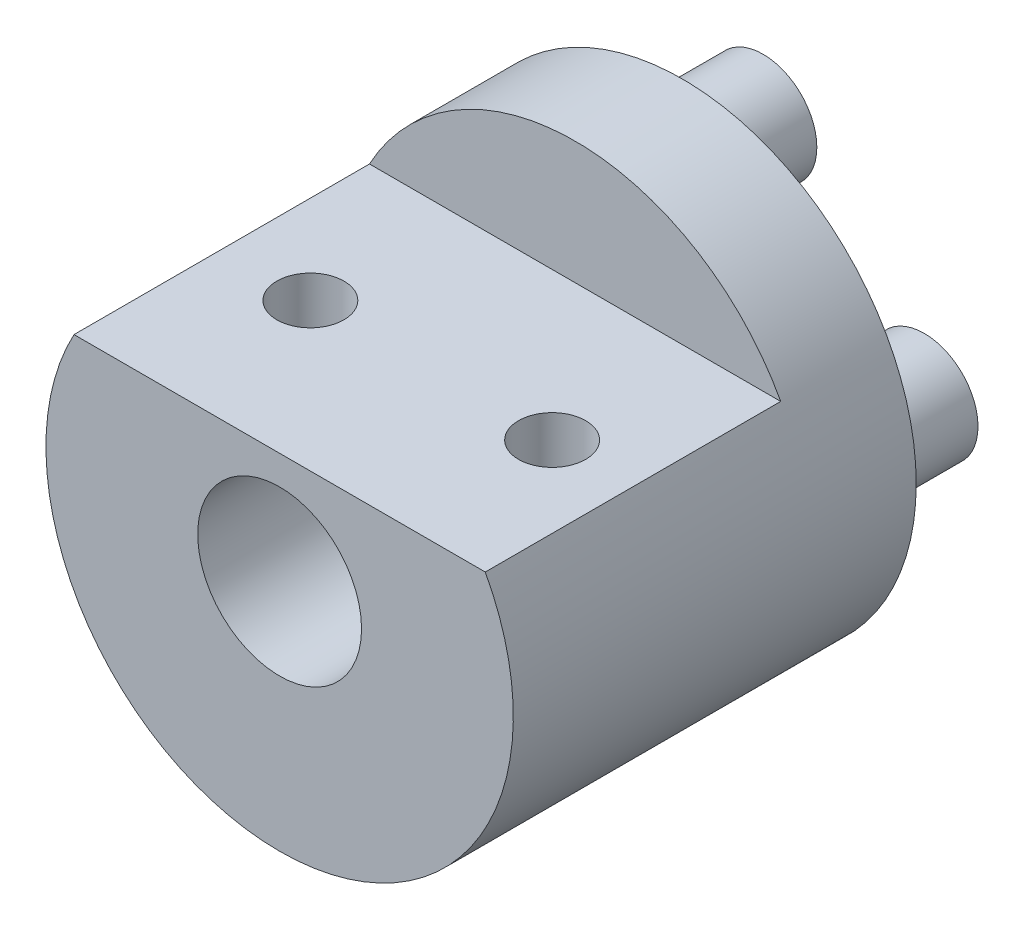
ISO-10303-21;
HEADER;
FILE_DESCRIPTION(('STEP AP214'),'2;1');
FILE_NAME('part.step','',(''),(''),'','','');
FILE_SCHEMA(('AUTOMOTIVE_DESIGN { 1 0 10303 214 1 1 1 1 }'));
ENDSEC;
DATA;
#1=APPLICATION_CONTEXT('core data for automotive mechanical design processes');
#2=APPLICATION_PROTOCOL_DEFINITION('international standard','automotive_design',2000,#1);
#3=PRODUCT_CONTEXT('',#1,'mechanical');
#4=PRODUCT('Part','Part','',(#3));
#5=PRODUCT_RELATED_PRODUCT_CATEGORY('part','',(#4));
#6=PRODUCT_DEFINITION_FORMATION('','',#4);
#7=PRODUCT_DEFINITION_CONTEXT('part definition',#1,'design');
#8=PRODUCT_DEFINITION('design','',#6,#7);
#9=PRODUCT_DEFINITION_SHAPE('','',#8);
#10=(LENGTH_UNIT() NAMED_UNIT(*) SI_UNIT(.MILLI.,.METRE.));
#11=(NAMED_UNIT(*) PLANE_ANGLE_UNIT() SI_UNIT($,.RADIAN.));
#12=(NAMED_UNIT(*) SI_UNIT($,.STERADIAN.) SOLID_ANGLE_UNIT());
#13=UNCERTAINTY_MEASURE_WITH_UNIT(LENGTH_MEASURE(1.E-05),#10,'distance_accuracy_value','');
#14=(GEOMETRIC_REPRESENTATION_CONTEXT(3) GLOBAL_UNCERTAINTY_ASSIGNED_CONTEXT((#13)) GLOBAL_UNIT_ASSIGNED_CONTEXT((#10,
#11,#12)) REPRESENTATION_CONTEXT('',''));
#15=CARTESIAN_POINT('',(0.,0.,0.));
#16=DIRECTION('',(0.,0.,1.));
#17=DIRECTION('',(1.,0.,0.));
#18=AXIS2_PLACEMENT_3D('',#15,#16,#17);
#19=CARTESIAN_POINT('',(0.,0.,15.));
#20=DIRECTION('',(0.,0.,-1.));
#21=DIRECTION('',(-1.,0.,0.));
#22=AXIS2_PLACEMENT_3D('',#19,#20,#21);
#23=CYLINDRICAL_SURFACE('',#22,1.75);
#24=CARTESIAN_POINT('',(0.,0.,2.7));
#25=DIRECTION('',(0.,0.,1.));
#26=DIRECTION('',(1.,0.,0.));
#27=AXIS2_PLACEMENT_3D('',#24,#25,#26);
#28=CIRCLE('',#27,1.75);
#29=CARTESIAN_POINT('',(1.75,0.,2.7));
#30=VERTEX_POINT('',#29);
#31=EDGE_CURVE('E96',#30,#30,#28,.T.);
#32=ORIENTED_EDGE('',*,*,#31,.T.);
#33=EDGE_LOOP('',(#32));
#34=FACE_BOUND('',#33,.T.);
#35=CARTESIAN_POINT('',(0.,0.,0.));
#36=DIRECTION('',(0.,0.,-1.));
#37=DIRECTION('',(-1.,0.,0.));
#38=AXIS2_PLACEMENT_3D('',#35,#36,#37);
#39=CIRCLE('',#38,1.75);
#40=CARTESIAN_POINT('',(-1.75,0.,0.));
#41=VERTEX_POINT('',#40);
#42=EDGE_CURVE('E87',#41,#41,#39,.T.);
#43=ORIENTED_EDGE('',*,*,#42,.T.);
#44=EDGE_LOOP('',(#43));
#45=FACE_BOUND('',#44,.T.);
#46=ADVANCED_FACE('F35',(#34,#45),#23,.F.);
#47=CARTESIAN_POINT('',(0.,0.,15.));
#48=DIRECTION('',(0.,0.,-1.));
#49=DIRECTION('',(-1.,0.,0.));
#50=AXIS2_PLACEMENT_3D('',#47,#48,#49);
#51=CYLINDRICAL_SURFACE('',#50,8.7);
#52=CARTESIAN_POINT('',(-4.35554645653572,-7.53121604158048,10.75));
#53=CARTESIAN_POINT('',(-4.28149878792105,-7.57403985078422,10.7499988824261));
#54=CARTESIAN_POINT('',(-4.20679899775351,-7.6157720088627,10.7434172999534));
#55=CARTESIAN_POINT('',(-4.058121338259,-7.69602383094756,10.7164465241141));
#56=CARTESIAN_POINT('',(-3.98414341685853,-7.73454372821252,10.6960583342979));
#57=CARTESIAN_POINT('',(-3.83901906859396,-7.8075966939334,10.6409439535076));
#58=CARTESIAN_POINT('',(-3.76788983037047,-7.84210742418347,10.6061419391379));
#59=CARTESIAN_POINT('',(-3.63192021432966,-7.90599758290411,10.5223639350081));
#60=CARTESIAN_POINT('',(-3.56707611267814,-7.93538005814271,10.4733964074525));
#61=CARTESIAN_POINT('',(-3.45309068809177,-7.98559036582203,10.3680263907658));
#62=CARTESIAN_POINT('',(-3.403021384501,-8.00698604983009,10.3128983850275));
#63=CARTESIAN_POINT('',(-3.31287797876676,-8.04470220268777,10.1934889195014));
#64=CARTESIAN_POINT('',(-3.27279774697054,-8.06102578548573,10.1292131113693));
#65=CARTESIAN_POINT('',(-3.20777259685441,-8.08710779781152,9.99986490603887));
#66=CARTESIAN_POINT('',(-3.18177054031545,-8.09733386209012,9.93541624887368));
#67=CARTESIAN_POINT('',(-3.14073715017222,-8.1133384408927,9.80259502329288));
#68=CARTESIAN_POINT('',(-3.12570217766223,-8.11911843066997,9.73422376453554));
#69=CARTESIAN_POINT('',(-3.10770192323431,-8.1260246466137,9.59904656186811));
#70=CARTESIAN_POINT('',(-3.10419120597139,-8.12736121821751,9.53232335431742));
#71=CARTESIAN_POINT('',(-3.10783924048391,-8.12596698689866,9.39921652288701));
#72=CARTESIAN_POINT('',(-3.11499661459986,-8.12323670916216,9.33283285627035));
#73=CARTESIAN_POINT('',(-3.13952852029316,-8.11378627715154,9.20318925821245));
#74=CARTESIAN_POINT('',(-3.15676797607309,-8.10711885987948,9.1398997975745));
#75=CARTESIAN_POINT('',(-3.2006856292849,-8.08988035802882,9.01725857483689));
#76=CARTESIAN_POINT('',(-3.22736391032928,-8.0793092388698,8.95790684762463));
#77=CARTESIAN_POINT('',(-3.28961835843052,-8.05416348708958,8.84381129378489));
#78=CARTESIAN_POINT('',(-3.32532164067727,-8.03953133982351,8.78914966344295));
#79=CARTESIAN_POINT('',(-3.40409496677691,-8.00649471425805,8.68672467884416));
#80=CARTESIAN_POINT('',(-3.44716605566785,-7.98808970074772,8.63896230494194));
#81=CARTESIAN_POINT('',(-3.54127451350286,-7.94683116418959,8.54927692058152));
#82=CARTESIAN_POINT('',(-3.5925838775501,-7.9238142286656,8.50771521837535));
#83=CARTESIAN_POINT('',(-3.699888900641,-7.87428188390073,8.433761787893));
#84=CARTESIAN_POINT('',(-3.75588591487718,-7.84776546167739,8.40137272335644));
#85=CARTESIAN_POINT('',(-3.87550593292527,-7.78943004826004,8.34379435180282));
#86=CARTESIAN_POINT('',(-3.93938069184815,-7.75735660195546,8.31938778678246));
#87=CARTESIAN_POINT('',(-4.06878585960677,-7.69027326452496,8.28146767074153));
#88=CARTESIAN_POINT('',(-4.13431697913613,-7.65526209743806,8.26795888034951));
#89=CARTESIAN_POINT('',(-4.27265001751912,-7.57900754201518,8.25059802402398));
#90=CARTESIAN_POINT('',(-4.34546050863245,-7.53750189370464,8.2479686247479));
#91=CARTESIAN_POINT('',(-4.48938692212858,-7.45267725421673,8.25509628897069));
#92=CARTESIAN_POINT('',(-4.56050214329249,-7.40935753242356,8.26485839044058));
#93=CARTESIAN_POINT('',(-4.70721575394475,-7.31713164912699,8.29788296987201));
#94=CARTESIAN_POINT('',(-4.78245207249042,-7.26813328827647,8.32250698462216));
#95=CARTESIAN_POINT('',(-4.92738169490002,-7.17067304207176,8.38565603972446));
#96=CARTESIAN_POINT('',(-4.99706784244223,-7.1222119165343,8.42419868342731));
#97=CARTESIAN_POINT('',(-5.13174031437103,-7.02583586020076,8.51665224966802));
#98=CARTESIAN_POINT('',(-5.19641593592393,-6.97802516326073,8.57112949773591));
#99=CARTESIAN_POINT('',(-5.31512710158141,-6.88802918069736,8.69440242509238));
#100=CARTESIAN_POINT('',(-5.36918991769288,-6.84582956871627,8.76316044440218));
#101=CARTESIAN_POINT('',(-5.44687989098039,-6.78402925327167,8.88775355171929));
#102=CARTESIAN_POINT('',(-5.47454434347002,-6.76168133970736,8.93972469392046));
#103=CARTESIAN_POINT('',(-5.52277650634889,-6.72234380609106,9.04876067975398));
#104=CARTESIAN_POINT('',(-5.54335112681032,-6.70534897008306,9.10582049504727));
#105=CARTESIAN_POINT('',(-5.5763339735623,-6.67794671715438,9.22434082718149));
#106=CARTESIAN_POINT('',(-5.58867457277922,-6.66759387782214,9.28583329891102));
#107=CARTESIAN_POINT('',(-5.60394145601439,-6.6547687662612,9.41078074175519));
#108=CARTESIAN_POINT('',(-5.60687466462078,-6.65229069758694,9.47423423464942));
#109=CARTESIAN_POINT('',(-5.60333517184121,-6.6552709784949,9.59266322631293));
#110=CARTESIAN_POINT('',(-5.59799726629332,-6.65977187131449,9.64770282965563));
#111=CARTESIAN_POINT('',(-5.58031434568902,-6.67459536231319,9.75582150908871));
#112=CARTESIAN_POINT('',(-5.56796868521173,-6.68491849672572,9.80890040411633));
#113=CARTESIAN_POINT('',(-5.53687983276616,-6.71069046084524,9.91216425556949));
#114=CARTESIAN_POINT('',(-5.51809925111089,-6.72616923203743,9.96233024840284));
#115=CARTESIAN_POINT('',(-5.47500815035938,-6.76129122797592,10.0586545118619));
#116=CARTESIAN_POINT('',(-5.45069410735352,-6.78093710594314,10.1048102025867));
#117=CARTESIAN_POINT('',(-5.38585488482925,-6.83263747879325,10.2115957394805));
#118=CARTESIAN_POINT('',(-5.34285612284773,-6.86639368630915,10.2699070306361));
#119=CARTESIAN_POINT('',(-5.24919553901838,-6.93825921107654,10.376906325849));
#120=CARTESIAN_POINT('',(-5.19852154155506,-6.97637542087524,10.4255787510451));
#121=CARTESIAN_POINT('',(-5.09035826441648,-7.05569331739473,10.5136451353217));
#122=CARTESIAN_POINT('',(-5.03278745787572,-7.09692924072274,10.5529073762566));
#123=CARTESIAN_POINT('',(-4.91268326175512,-7.18059197855183,10.6211007726175));
#124=CARTESIAN_POINT('',(-4.85015155631513,-7.22301838576966,10.650035415897));
#125=CARTESIAN_POINT('',(-4.71738413097553,-7.31046988360632,10.6986923816817));
#126=CARTESIAN_POINT('',(-4.64691138202164,-7.35549922429417,10.7177632502662));
#127=CARTESIAN_POINT('',(-4.50302567704536,-7.44445522884208,10.7434185422925));
#128=CARTESIAN_POINT('',(-4.42961228753875,-7.48838172856658,10.750001117848));
#129=CARTESIAN_POINT('',(-4.35554645653572,-7.53121604158048,10.75));
#130=B_SPLINE_CURVE_WITH_KNOTS('',3,(#52,#53,#54,#55,#56,#57,#58,#59,#60,#61,#62,#63,#64,#65,
#66,#67,#68,#69,#70,#71,#72,#73,#74,#75,#76,#77,#78,#79,#80,#81,#82,#83,#84,#85,#86,#87,#88,#89,
#90,#91,#92,#93,#94,#95,#96,#97,#98,#99,#100,#101,#102,#103,#104,#105,#106,#107,#108,#109,#110,
#111,#112,#113,#114,#115,#116,#117,#118,#119,#120,#121,#122,#123,#124,#125,#126,#127,#128,#129),
.UNSPECIFIED.,.T.,.F.,(4,2,2,2,2,2,2,2,2,2,2,2,2,2,2,2,2,2,2,2,2,2,2,2,2,2,2,2,2,2,2,2,2,2,2,2,
2,2,4),(0.,0.256354012468137,0.512689393529676,0.770390698269476,1.02793837400122,
1.25911786387568,1.49015514249363,1.69981973094638,1.90941472048425,2.1089347352682,
2.30842898660295,2.50530981037037,2.7021923782227,2.90201966410702,3.10187531671454,
3.31076028448924,3.51970585053031,3.74535814046613,3.97110895197533,4.22163818513199,
4.47226930775334,4.75035105872889,5.02878574774849,5.31865944443633,5.60777820314424,
5.79600067095043,5.98403916625163,6.17360363552678,6.36302853820438,6.52866853488511,
6.69432378964269,6.86095837132265,7.02769937040053,7.26619354220559,7.50507009054242,
7.74711702856552,7.98908214457701,8.24546110217311,8.50187799307103),.UNSPECIFIED.);
#131=CARTESIAN_POINT('',(-4.35554645653572,-7.53121604158048,10.75));
#132=VERTEX_POINT('',#131);
#133=EDGE_CURVE('E107',#132,#132,#130,.T.);
#134=ORIENTED_EDGE('',*,*,#133,.T.);
#135=EDGE_LOOP('',(#134));
#136=FACE_BOUND('',#135,.T.);
#137=CARTESIAN_POINT('',(4.64445354346428,-7.35656518237976,10.75));
#138=CARTESIAN_POINT('',(4.73428230230111,-7.29984922243143,10.7499983136137));
#139=CARTESIAN_POINT('',(4.82314577905018,-7.2414214920152,10.7403108379036));
#140=CARTESIAN_POINT('',(4.99618931123596,-7.12314110640561,10.7027704708671));
#141=CARTESIAN_POINT('',(5.08035622320646,-7.06328506205961,10.6748691285672));
#142=CARTESIAN_POINT('',(5.23709976608238,-6.94778668937354,10.6037511868211));
#143=CARTESIAN_POINT('',(5.31005914949701,-6.8920935616727,10.5614604777866));
#144=CARTESIAN_POINT('',(5.44746861487665,-6.78400224565856,10.4616938314708));
#145=CARTESIAN_POINT('',(5.51193557488742,-6.73159763369121,10.4042487165379));
#146=CARTESIAN_POINT('',(5.61247164751777,-6.6477912175443,10.2932781396885));
#147=CARTESIAN_POINT('',(5.65133098499533,-6.61473024986206,10.2435228607141));
#148=CARTESIAN_POINT('',(5.72212601356684,-6.55358307905767,10.1365683333737));
#149=CARTESIAN_POINT('',(5.75407214642718,-6.52548938523095,10.0793805232828));
#150=CARTESIAN_POINT('',(5.80407862243176,-6.48101655237665,9.96975939795487));
#151=CARTESIAN_POINT('',(5.82362544498334,-6.46342498298962,9.91850141315648));
#152=CARTESIAN_POINT('',(5.85607411170827,-6.43404059214989,9.81232782637395));
#153=CARTESIAN_POINT('',(5.86898090000497,-6.42224345649926,9.75741498028328));
#154=CARTESIAN_POINT('',(5.88733274949459,-6.40542544533612,9.64495913743597));
#155=CARTESIAN_POINT('',(5.8927319531199,-6.40044621752587,9.5874021759067));
#156=CARTESIAN_POINT('',(5.89547077483609,-6.39792385227537,9.47193836952545));
#157=CARTESIAN_POINT('',(5.89281267574331,-6.40037860861885,9.41403162841342));
#158=CARTESIAN_POINT('',(5.8803145370671,-6.41186077166845,9.30546860491093));
#159=CARTESIAN_POINT('',(5.8711968165059,-6.42022692943234,9.25465421489561));
#160=CARTESIAN_POINT('',(5.84715372230549,-6.44213135546349,9.15559624757732));
#161=CARTESIAN_POINT('',(5.83222594517264,-6.45567176416327,9.10735374361014));
#162=CARTESIAN_POINT('',(5.79178353899904,-6.49200967224084,8.99959500985601));
#163=CARTESIAN_POINT('',(5.76441582800212,-6.51637925823997,8.94130530481673));
#164=CARTESIAN_POINT('',(5.70253292637202,-6.57060229886083,8.83144795773739));
#165=CARTESIAN_POINT('',(5.66800402887094,-6.60046625742358,8.77989352038598));
#166=CARTESIAN_POINT('',(5.58212637813298,-6.67337141569234,8.66964683231964));
#167=CARTESIAN_POINT('',(5.5288205973738,-6.7177010498057,8.61333514100248));
#168=CARTESIAN_POINT('',(5.41473924025292,-6.80999269762562,8.51259861249486));
#169=CARTESIAN_POINT('',(5.35395811347324,-6.85795740009236,8.46818268657257));
#170=CARTESIAN_POINT('',(5.22551182965627,-6.95634016347321,8.39068473335128));
#171=CARTESIAN_POINT('',(5.15775364445237,-7.00678490611968,8.35779141943087));
#172=CARTESIAN_POINT('',(5.01757945724511,-7.10783858414739,8.30463528314732));
#173=CARTESIAN_POINT('',(4.94516309441601,-7.15844753195906,8.28437344052975));
#174=CARTESIAN_POINT('',(4.78784248337087,-7.26475325035045,8.25536979485192));
#175=CARTESIAN_POINT('',(4.70250509742067,-7.32030018077563,8.24837370267425));
#176=CARTESIAN_POINT('',(4.53013885869342,-7.42820094909709,8.25225948480602));
#177=CARTESIAN_POINT('',(4.44310987202303,-7.48055453286571,8.2631427800434));
#178=CARTESIAN_POINT('',(4.27551026178594,-7.57752283881265,8.30276638982953));
#179=CARTESIAN_POINT('',(4.19485300894459,-7.62240792215604,8.33046050509193));
#180=CARTESIAN_POINT('',(4.03852709516364,-7.70637063686511,8.40329527767624));
#181=CARTESIAN_POINT('',(3.96285241043469,-7.74545535520232,8.44841439784484));
#182=CARTESIAN_POINT('',(3.83070902315208,-7.81155318704061,8.54806493409714));
#183=CARTESIAN_POINT('',(3.77303552262498,-7.83949071523474,8.60038535582493));
#184=CARTESIAN_POINT('',(3.66739710700461,-7.88946227952929,8.71642059311788));
#185=CARTESIAN_POINT('',(3.61942318987217,-7.9115017956929,8.78012473919169));
#186=CARTESIAN_POINT('',(3.54120325208681,-7.94679127845431,8.90818850674592));
#187=CARTESIAN_POINT('',(3.50948066909118,-7.96080140401014,8.97144075970005));
#188=CARTESIAN_POINT('',(3.45699188303596,-7.98373559751052,9.10319561440127));
#189=CARTESIAN_POINT('',(3.43622011334944,-7.99266224972251,9.17169552828291));
#190=CARTESIAN_POINT('',(3.40773007893375,-8.00484840453101,9.30656479696421));
#191=CARTESIAN_POINT('',(3.399169479977,-8.00847409166782,9.37272455138988));
#192=CARTESIAN_POINT('',(3.39269787183453,-8.01121809913537,9.50565076932581));
#193=CARTESIAN_POINT('',(3.39478455158121,-8.01033739760974,9.57241709803437));
#194=CARTESIAN_POINT('',(3.4093205911866,-8.00416082818338,9.70283219411439));
#195=CARTESIAN_POINT('',(3.42149946050285,-7.9989802009672,9.76651689580116));
#196=CARTESIAN_POINT('',(3.45536613556075,-7.98440866320842,9.89079265559));
#197=CARTESIAN_POINT('',(3.47705379740851,-7.97501781637784,9.95138376049112));
#198=CARTESIAN_POINT('',(3.52934766517927,-7.95201387607259,10.0685027701869));
#199=CARTESIAN_POINT('',(3.56004550108902,-7.93835730536109,10.1249810937992));
#200=CARTESIAN_POINT('',(3.62907392856332,-7.90703829819907,10.2318135829642));
#201=CARTESIAN_POINT('',(3.66740533499118,-7.8893754340594,10.2821670937842));
#202=CARTESIAN_POINT('',(3.75222785187461,-7.84939984398766,10.3779001673907));
#203=CARTESIAN_POINT('',(3.79901299741493,-7.82691073092811,10.4229447992096));
#204=CARTESIAN_POINT('',(3.897769094742,-7.77820206669522,10.5045245274185));
#205=CARTESIAN_POINT('',(3.94974245108751,-7.75198078336838,10.5410556516885));
#206=CARTESIAN_POINT('',(4.06183113668099,-7.69388320320527,10.6080017173438));
#207=CARTESIAN_POINT('',(4.12226293250348,-7.66171551941534,10.6376311975813));
#208=CARTESIAN_POINT('',(4.24543121382603,-7.59415858454734,10.6864528626467));
#209=CARTESIAN_POINT('',(4.30816693121406,-7.55877040144969,10.7056484929251));
#210=CARTESIAN_POINT('',(4.41673000242855,-7.49568348641554,10.7299657532556));
#211=CARTESIAN_POINT('',(4.46238878582519,-7.46859577643745,10.7375203034684));
#212=CARTESIAN_POINT('',(4.55359807559967,-7.41333894036497,10.7475379555902));
#213=CARTESIAN_POINT('',(4.59914857750075,-7.38516977035714,10.7500008505257));
#214=CARTESIAN_POINT('',(4.64445354346428,-7.35656518237976,10.75));
#215=B_SPLINE_CURVE_WITH_KNOTS('',3,(#137,#138,#139,#140,#141,#142,#143,#144,#145,#146,#147,
#148,#149,#150,#151,#152,#153,#154,#155,#156,#157,#158,#159,#160,#161,#162,#163,#164,#165,#166,
#167,#168,#169,#170,#171,#172,#173,#174,#175,#176,#177,#178,#179,#180,#181,#182,#183,#184,#185,
#186,#187,#188,#189,#190,#191,#192,#193,#194,#195,#196,#197,#198,#199,#200,#201,#202,#203,#204,
#205,#206,#207,#208,#209,#210,#211,#212,#213,#214),.UNSPECIFIED.,.T.,.F.,(4,2,2,2,2,2,2,2,2,2,2,
2,2,2,2,2,2,2,2,2,2,2,2,2,2,2,2,2,2,2,2,2,2,2,2,2,2,2,4),(0.,0.318485737291531,
0.637822154582837,0.939609839498167,1.24078839233826,1.45385301696372,1.66659354527922,
1.83873587250943,2.01074983756833,2.18380994441863,2.35682102400452,2.51303517855028,
2.66931402428599,2.8747461182859,3.08057510973484,3.34712090760409,3.61386582332708,
3.8847949266197,4.15574504160377,4.46038594886418,4.76505106801209,5.05246213925765,
5.33951910400322,5.58627180592603,5.83279443836167,6.04805794681694,6.26321192460611,
6.46265706128622,6.66205890882225,6.85628296835601,7.05050408885306,7.24677316875707,
7.44306321110347,7.64837403869651,7.85378046658136,8.07667389580228,8.29949367670213,
8.46011483164745,8.62074251563972),.UNSPECIFIED.);
#216=CARTESIAN_POINT('',(4.64445354346428,-7.35656518237976,10.75));
#217=VERTEX_POINT('',#216);
#218=EDGE_CURVE('E100',#217,#217,#215,.T.);
#219=ORIENTED_EDGE('',*,*,#218,.T.);
#220=EDGE_LOOP('',(#219));
#221=FACE_BOUND('',#220,.T.);
#222=CARTESIAN_POINT('',(0.,0.,15.));
#223=DIRECTION('',(0.,0.,1.));
#224=DIRECTION('',(1.,0.,0.));
#225=AXIS2_PLACEMENT_3D('',#222,#223,#224);
#226=CIRCLE('',#225,8.7);
#227=CARTESIAN_POINT('',(-7.65554645653572,4.1331112314845,15.));
#228=VERTEX_POINT('',#227);
#229=CARTESIAN_POINT('',(7.65554645653572,4.1331112314845,15.));
#230=VERTEX_POINT('',#229);
#231=EDGE_CURVE('E67',#228,#230,#226,.T.);
#232=ORIENTED_EDGE('',*,*,#231,.F.);
#233=DIRECTION('',(0.,0.,1.));
#234=VECTOR('',#233,1.);
#235=CARTESIAN_POINT('',(-7.65554645653572,4.1331112314845,4.));
#236=LINE('',#235,#234);
#237=CARTESIAN_POINT('',(-7.65554645653572,4.1331112314845,4.));
#238=VERTEX_POINT('',#237);
#239=EDGE_CURVE('E50',#238,#228,#236,.T.);
#240=ORIENTED_EDGE('',*,*,#239,.F.);
#241=CARTESIAN_POINT('',(0.,0.,4.));
#242=DIRECTION('',(0.,0.,1.));
#243=DIRECTION('',(1.,0.,0.));
#244=AXIS2_PLACEMENT_3D('',#241,#242,#243);
#245=CIRCLE('',#244,8.7);
#246=CARTESIAN_POINT('',(7.65554645653572,4.1331112314845,4.));
#247=VERTEX_POINT('',#246);
#248=EDGE_CURVE('E57',#247,#238,#245,.T.);
#249=ORIENTED_EDGE('',*,*,#248,.F.);
#250=DIRECTION('',(0.,0.,-1.));
#251=VECTOR('',#250,1.);
#252=CARTESIAN_POINT('',(7.65554645653572,4.1331112314845,15.));
#253=LINE('',#252,#251);
#254=EDGE_CURVE('E70',#247,#230,#253,.F.);
#255=ORIENTED_EDGE('',*,*,#254,.T.);
#256=EDGE_LOOP('',(#232,#240,#249,#255));
#257=FACE_BOUND('',#256,.T.);
#258=CARTESIAN_POINT('',(0.,0.,0.));
#259=DIRECTION('',(0.,0.,1.));
#260=DIRECTION('',(1.,0.,0.));
#261=AXIS2_PLACEMENT_3D('',#258,#259,#260);
#262=CIRCLE('',#261,8.7);
#263=CARTESIAN_POINT('',(8.7,0.,0.));
#264=VERTEX_POINT('',#263);
#265=EDGE_CURVE('E90',#264,#264,#262,.T.);
#266=ORIENTED_EDGE('',*,*,#265,.T.);
#267=EDGE_LOOP('',(#266));
#268=FACE_BOUND('',#267,.T.);
#269=ADVANCED_FACE('F74',(#136,#221,#257,#268),#51,.T.);
#270=CARTESIAN_POINT('',(0.,0.,15.));
#271=DIRECTION('',(0.,0.,1.));
#272=DIRECTION('',(1.,0.,0.));
#273=AXIS2_PLACEMENT_3D('',#270,#271,#272);
#274=PLANE('',#273);
#275=DIRECTION('',(1.,0.,0.));
#276=VECTOR('',#275,1.);
#277=CARTESIAN_POINT('',(-7.65554645653572,4.1331112314845,15.));
#278=LINE('',#277,#276);
#279=EDGE_CURVE('E71',#228,#230,#278,.T.);
#280=ORIENTED_EDGE('',*,*,#279,.F.);
#281=ORIENTED_EDGE('',*,*,#231,.T.);
#282=EDGE_LOOP('',(#280,#281));
#283=FACE_BOUND('',#282,.T.);
#284=CARTESIAN_POINT('',(0.,0.,15.));
#285=DIRECTION('',(0.,0.,1.));
#286=DIRECTION('',(1.,0.,0.));
#287=AXIS2_PLACEMENT_3D('',#284,#285,#286);
#288=CIRCLE('',#287,3.05);
#289=CARTESIAN_POINT('',(3.05,0.,15.));
#290=VERTEX_POINT('',#289);
#291=EDGE_CURVE('E78',#290,#290,#288,.T.);
#292=ORIENTED_EDGE('',*,*,#291,.F.);
#293=EDGE_LOOP('',(#292));
#294=FACE_BOUND('',#293,.T.);
#295=ADVANCED_FACE('F139',(#283,#294),#274,.T.);
#296=CARTESIAN_POINT('',(0.,0.,0.));
#297=DIRECTION('',(0.,0.,1.));
#298=DIRECTION('',(1.,0.,0.));
#299=AXIS2_PLACEMENT_3D('',#296,#297,#298);
#300=PLANE('',#299);
#301=CARTESIAN_POINT('',(6.,0.,0.));
#302=DIRECTION('',(0.,0.,1.));
#303=DIRECTION('',(1.,0.,0.));
#304=AXIS2_PLACEMENT_3D('',#301,#302,#303);
#305=CIRCLE('',#304,2.);
#306=CARTESIAN_POINT('',(8.,0.,0.));
#307=VERTEX_POINT('',#306);
#308=EDGE_CURVE('E12',#307,#307,#305,.F.);
#309=ORIENTED_EDGE('',*,*,#308,.F.);
#310=EDGE_LOOP('',(#309));
#311=FACE_BOUND('',#310,.T.);
#312=CARTESIAN_POINT('',(0.,-6.,0.));
#313=DIRECTION('',(0.,0.,1.));
#314=DIRECTION('',(1.,0.,0.));
#315=AXIS2_PLACEMENT_3D('',#312,#313,#314);
#316=CIRCLE('',#315,2.);
#317=CARTESIAN_POINT('',(2.,-6.,0.));
#318=VERTEX_POINT('',#317);
#319=EDGE_CURVE('E43',#318,#318,#316,.F.);
#320=ORIENTED_EDGE('',*,*,#319,.F.);
#321=EDGE_LOOP('',(#320));
#322=FACE_BOUND('',#321,.T.);
#323=CARTESIAN_POINT('',(-6.,0.,0.));
#324=DIRECTION('',(0.,0.,1.));
#325=DIRECTION('',(1.,0.,0.));
#326=AXIS2_PLACEMENT_3D('',#323,#324,#325);
#327=CIRCLE('',#326,2.);
#328=CARTESIAN_POINT('',(-4.,0.,0.));
#329=VERTEX_POINT('',#328);
#330=EDGE_CURVE('E154',#329,#329,#327,.F.);
#331=ORIENTED_EDGE('',*,*,#330,.F.);
#332=EDGE_LOOP('',(#331));
#333=FACE_BOUND('',#332,.T.);
#334=CARTESIAN_POINT('',(0.,6.,0.));
#335=DIRECTION('',(0.,0.,1.));
#336=DIRECTION('',(1.,0.,0.));
#337=AXIS2_PLACEMENT_3D('',#334,#335,#336);
#338=CIRCLE('',#337,2.);
#339=CARTESIAN_POINT('',(2.,6.,0.));
#340=VERTEX_POINT('',#339);
#341=EDGE_CURVE('E99',#340,#340,#338,.F.);
#342=ORIENTED_EDGE('',*,*,#341,.F.);
#343=EDGE_LOOP('',(#342));
#344=FACE_BOUND('',#343,.T.);
#345=ORIENTED_EDGE('',*,*,#42,.F.);
#346=EDGE_LOOP('',(#345));
#347=FACE_BOUND('',#346,.T.);
#348=ORIENTED_EDGE('',*,*,#265,.F.);
#349=EDGE_LOOP('',(#348));
#350=FACE_BOUND('',#349,.T.);
#351=ADVANCED_FACE('F131',(#311,#322,#333,#344,#347,#350),#300,.F.);
#352=CARTESIAN_POINT('',(0.,0.,3.));
#353=DIRECTION('',(0.,0.,1.));
#354=DIRECTION('',(1.,0.,0.));
#355=AXIS2_PLACEMENT_3D('',#352,#353,#354);
#356=PLANE('',#355);
#357=CARTESIAN_POINT('',(0.,0.,3.));
#358=DIRECTION('',(0.,0.,1.));
#359=DIRECTION('',(1.,0.,0.));
#360=AXIS2_PLACEMENT_3D('',#357,#358,#359);
#361=CIRCLE('',#360,2.05);
#362=CARTESIAN_POINT('',(2.05,0.,3.));
#363=VERTEX_POINT('',#362);
#364=EDGE_CURVE('E66',#363,#363,#361,.F.);
#365=ORIENTED_EDGE('',*,*,#364,.T.);
#366=EDGE_LOOP('',(#365));
#367=FACE_BOUND('',#366,.T.);
#368=CARTESIAN_POINT('',(0.,0.,3.));
#369=DIRECTION('',(0.,0.,1.));
#370=DIRECTION('',(1.,0.,0.));
#371=AXIS2_PLACEMENT_3D('',#368,#369,#370);
#372=CIRCLE('',#371,3.05);
#373=CARTESIAN_POINT('',(3.05,0.,3.));
#374=VERTEX_POINT('',#373);
#375=EDGE_CURVE('E84',#374,#374,#372,.F.);
#376=ORIENTED_EDGE('',*,*,#375,.F.);
#377=EDGE_LOOP('',(#376));
#378=FACE_BOUND('',#377,.T.);
#379=ADVANCED_FACE('F128',(#367,#378),#356,.T.);
#380=CARTESIAN_POINT('',(0.,0.,-8.62670273047588));
#381=DIRECTION('',(0.,0.,1.));
#382=DIRECTION('',(1.,0.,0.));
#383=AXIS2_PLACEMENT_3D('',#380,#381,#382);
#384=CYLINDRICAL_SURFACE('',#383,3.05);
#385=ORIENTED_EDGE('',*,*,#375,.T.);
#386=EDGE_LOOP('',(#385));
#387=FACE_BOUND('',#386,.T.);
#388=ORIENTED_EDGE('',*,*,#291,.T.);
#389=EDGE_LOOP('',(#388));
#390=FACE_BOUND('',#389,.T.);
#391=ADVANCED_FACE('F124',(#387,#390),#384,.F.);
#392=CARTESIAN_POINT('',(0.,0.,4.));
#393=DIRECTION('',(0.,0.,1.));
#394=DIRECTION('',(1.,0.,0.));
#395=AXIS2_PLACEMENT_3D('',#392,#393,#394);
#396=PLANE('',#395);
#397=DIRECTION('',(1.,0.,0.));
#398=VECTOR('',#397,1.);
#399=CARTESIAN_POINT('',(-7.65554645653572,4.1331112314845,4.));
#400=LINE('',#399,#398);
#401=EDGE_CURVE('E65',#238,#247,#400,.T.);
#402=ORIENTED_EDGE('',*,*,#401,.T.);
#403=ORIENTED_EDGE('',*,*,#248,.T.);
#404=EDGE_LOOP('',(#402,#403));
#405=FACE_BOUND('',#404,.T.);
#406=ADVANCED_FACE('F64',(#405),#396,.T.);
#407=CARTESIAN_POINT('',(-7.65554645653572,4.1331112314845,4.));
#408=DIRECTION('',(0.,-1.,0.));
#409=DIRECTION('',(0.,0.,-1.));
#410=AXIS2_PLACEMENT_3D('',#407,#408,#409);
#411=PLANE('',#410);
#412=CARTESIAN_POINT('',(-4.35554645653572,4.1331112314845,9.5));
#413=DIRECTION('',(0.,1.,0.));
#414=DIRECTION('',(0.,0.,1.));
#415=AXIS2_PLACEMENT_3D('',#412,#413,#414);
#416=CIRCLE('',#415,1.25);
#417=CARTESIAN_POINT('',(-4.35554645653572,4.1331112314845,10.75));
#418=VERTEX_POINT('',#417);
#419=EDGE_CURVE('E171',#418,#418,#416,.T.);
#420=ORIENTED_EDGE('',*,*,#419,.F.);
#421=EDGE_LOOP('',(#420));
#422=FACE_BOUND('',#421,.T.);
#423=CARTESIAN_POINT('',(4.64445354346428,4.1331112314845,9.5));
#424=DIRECTION('',(0.,1.,0.));
#425=DIRECTION('',(0.,0.,1.));
#426=AXIS2_PLACEMENT_3D('',#423,#424,#425);
#427=CIRCLE('',#426,1.25);
#428=CARTESIAN_POINT('',(4.64445354346428,4.1331112314845,10.75));
#429=VERTEX_POINT('',#428);
#430=EDGE_CURVE('E106',#429,#429,#427,.T.);
#431=ORIENTED_EDGE('',*,*,#430,.F.);
#432=EDGE_LOOP('',(#431));
#433=FACE_BOUND('',#432,.T.);
#434=ORIENTED_EDGE('',*,*,#401,.F.);
#435=ORIENTED_EDGE('',*,*,#239,.T.);
#436=ORIENTED_EDGE('',*,*,#279,.T.);
#437=ORIENTED_EDGE('',*,*,#254,.F.);
#438=EDGE_LOOP('',(#434,#435,#436,#437));
#439=FACE_BOUND('',#438,.T.);
#440=ADVANCED_FACE('F69',(#422,#433,#439),#411,.F.);
#441=CARTESIAN_POINT('',(0.,0.,2.7));
#442=DIRECTION('',(0.,0.,1.));
#443=DIRECTION('',(1.,0.,0.));
#444=AXIS2_PLACEMENT_3D('',#441,#442,#443);
#445=TOROIDAL_SURFACE('',#444,2.05,0.3);
#446=ORIENTED_EDGE('',*,*,#31,.F.);
#447=EDGE_LOOP('',(#446));
#448=FACE_BOUND('',#447,.T.);
#449=ORIENTED_EDGE('',*,*,#364,.F.);
#450=EDGE_LOOP('',(#449));
#451=FACE_BOUND('',#450,.T.);
#452=ADVANCED_FACE('F37',(#448,#451),#445,.T.);
#453=CARTESIAN_POINT('',(4.64445354346428,4.1331112314845,9.5));
#454=DIRECTION('',(0.,1.,0.));
#455=DIRECTION('',(0.,0.,1.));
#456=AXIS2_PLACEMENT_3D('',#453,#454,#455);
#457=CYLINDRICAL_SURFACE('',#456,1.25);
#458=ORIENTED_EDGE('',*,*,#430,.T.);
#459=EDGE_LOOP('',(#458));
#460=FACE_BOUND('',#459,.T.);
#461=ORIENTED_EDGE('',*,*,#218,.F.);
#462=EDGE_LOOP('',(#461));
#463=FACE_BOUND('',#462,.T.);
#464=ADVANCED_FACE('F114',(#460,#463),#457,.F.);
#465=CARTESIAN_POINT('',(-4.35554645653572,4.1331112314845,9.5));
#466=DIRECTION('',(0.,1.,0.));
#467=DIRECTION('',(0.,0.,1.));
#468=AXIS2_PLACEMENT_3D('',#465,#466,#467);
#469=CYLINDRICAL_SURFACE('',#468,1.25);
#470=ORIENTED_EDGE('',*,*,#419,.T.);
#471=EDGE_LOOP('',(#470));
#472=FACE_BOUND('',#471,.T.);
#473=ORIENTED_EDGE('',*,*,#133,.F.);
#474=EDGE_LOOP('',(#473));
#475=FACE_BOUND('',#474,.T.);
#476=ADVANCED_FACE('F118',(#472,#475),#469,.F.);
#477=CARTESIAN_POINT('',(0.,6.,-3.));
#478=DIRECTION('',(0.,0.,1.));
#479=DIRECTION('',(1.,0.,0.));
#480=AXIS2_PLACEMENT_3D('',#477,#478,#479);
#481=CYLINDRICAL_SURFACE('',#480,2.);
#482=CARTESIAN_POINT('',(0.,6.,-3.));
#483=DIRECTION('',(0.,0.,-1.));
#484=DIRECTION('',(-1.,0.,0.));
#485=AXIS2_PLACEMENT_3D('',#482,#483,#484);
#486=CIRCLE('',#485,2.);
#487=CARTESIAN_POINT('',(-2.,6.,-3.));
#488=VERTEX_POINT('',#487);
#489=EDGE_CURVE('E175',#488,#488,#486,.T.);
#490=ORIENTED_EDGE('',*,*,#489,.F.);
#491=EDGE_LOOP('',(#490));
#492=FACE_BOUND('',#491,.T.);
#493=ORIENTED_EDGE('',*,*,#341,.T.);
#494=EDGE_LOOP('',(#493));
#495=FACE_BOUND('',#494,.T.);
#496=ADVANCED_FACE('F221',(#492,#495),#481,.T.);
#497=CARTESIAN_POINT('',(0.,6.,-3.));
#498=DIRECTION('',(0.,0.,-1.));
#499=DIRECTION('',(-1.,0.,0.));
#500=AXIS2_PLACEMENT_3D('',#497,#498,#499);
#501=PLANE('',#500);
#502=ORIENTED_EDGE('',*,*,#489,.T.);
#503=EDGE_LOOP('',(#502));
#504=FACE_BOUND('',#503,.T.);
#505=ADVANCED_FACE('F218',(#504),#501,.T.);
#506=CARTESIAN_POINT('',(-6.,0.,-3.));
#507=DIRECTION('',(0.,0.,1.));
#508=DIRECTION('',(1.,0.,0.));
#509=AXIS2_PLACEMENT_3D('',#506,#507,#508);
#510=CYLINDRICAL_SURFACE('',#509,2.);
#511=CARTESIAN_POINT('',(-6.,0.,-3.));
#512=DIRECTION('',(0.,0.,-1.));
#513=DIRECTION('',(-1.,0.,0.));
#514=AXIS2_PLACEMENT_3D('',#511,#512,#513);
#515=CIRCLE('',#514,2.);
#516=CARTESIAN_POINT('',(-8.,0.,-3.));
#517=VERTEX_POINT('',#516);
#518=EDGE_CURVE('E180',#517,#517,#515,.T.);
#519=ORIENTED_EDGE('',*,*,#518,.F.);
#520=EDGE_LOOP('',(#519));
#521=FACE_BOUND('',#520,.T.);
#522=ORIENTED_EDGE('',*,*,#330,.T.);
#523=EDGE_LOOP('',(#522));
#524=FACE_BOUND('',#523,.T.);
#525=ADVANCED_FACE('F214',(#521,#524),#510,.T.);
#526=CARTESIAN_POINT('',(-6.,0.,-3.));
#527=DIRECTION('',(0.,0.,-1.));
#528=DIRECTION('',(-1.,0.,0.));
#529=AXIS2_PLACEMENT_3D('',#526,#527,#528);
#530=PLANE('',#529);
#531=ORIENTED_EDGE('',*,*,#518,.T.);
#532=EDGE_LOOP('',(#531));
#533=FACE_BOUND('',#532,.T.);
#534=ADVANCED_FACE('F210',(#533),#530,.T.);
#535=CARTESIAN_POINT('',(0.,-6.,-3.));
#536=DIRECTION('',(0.,0.,1.));
#537=DIRECTION('',(1.,0.,0.));
#538=AXIS2_PLACEMENT_3D('',#535,#536,#537);
#539=CYLINDRICAL_SURFACE('',#538,2.);
#540=CARTESIAN_POINT('',(0.,-6.,-3.));
#541=DIRECTION('',(0.,0.,-1.));
#542=DIRECTION('',(-1.,0.,0.));
#543=AXIS2_PLACEMENT_3D('',#540,#541,#542);
#544=CIRCLE('',#543,2.);
#545=CARTESIAN_POINT('',(-2.,-6.,-3.));
#546=VERTEX_POINT('',#545);
#547=EDGE_CURVE('E185',#546,#546,#544,.T.);
#548=ORIENTED_EDGE('',*,*,#547,.F.);
#549=EDGE_LOOP('',(#548));
#550=FACE_BOUND('',#549,.T.);
#551=ORIENTED_EDGE('',*,*,#319,.T.);
#552=EDGE_LOOP('',(#551));
#553=FACE_BOUND('',#552,.T.);
#554=ADVANCED_FACE('F204',(#550,#553),#539,.T.);
#555=CARTESIAN_POINT('',(0.,-6.,-3.));
#556=DIRECTION('',(0.,0.,-1.));
#557=DIRECTION('',(-1.,0.,0.));
#558=AXIS2_PLACEMENT_3D('',#555,#556,#557);
#559=PLANE('',#558);
#560=ORIENTED_EDGE('',*,*,#547,.T.);
#561=EDGE_LOOP('',(#560));
#562=FACE_BOUND('',#561,.T.);
#563=ADVANCED_FACE('F197',(#562),#559,.T.);
#564=CARTESIAN_POINT('',(6.,0.,-3.));
#565=DIRECTION('',(0.,0.,1.));
#566=DIRECTION('',(1.,0.,0.));
#567=AXIS2_PLACEMENT_3D('',#564,#565,#566);
#568=CYLINDRICAL_SURFACE('',#567,2.);
#569=CARTESIAN_POINT('',(6.,0.,-3.));
#570=DIRECTION('',(0.,0.,-1.));
#571=DIRECTION('',(-1.,0.,0.));
#572=AXIS2_PLACEMENT_3D('',#569,#570,#571);
#573=CIRCLE('',#572,2.);
#574=CARTESIAN_POINT('',(4.,0.,-3.));
#575=VERTEX_POINT('',#574);
#576=EDGE_CURVE('E188',#575,#575,#573,.T.);
#577=ORIENTED_EDGE('',*,*,#576,.F.);
#578=EDGE_LOOP('',(#577));
#579=FACE_BOUND('',#578,.T.);
#580=ORIENTED_EDGE('',*,*,#308,.T.);
#581=EDGE_LOOP('',(#580));
#582=FACE_BOUND('',#581,.T.);
#583=ADVANCED_FACE('F194',(#579,#582),#568,.T.);
#584=CARTESIAN_POINT('',(6.,0.,-3.));
#585=DIRECTION('',(0.,0.,-1.));
#586=DIRECTION('',(-1.,0.,0.));
#587=AXIS2_PLACEMENT_3D('',#584,#585,#586);
#588=PLANE('',#587);
#589=ORIENTED_EDGE('',*,*,#576,.T.);
#590=EDGE_LOOP('',(#589));
#591=FACE_BOUND('',#590,.T.);
#592=ADVANCED_FACE('F192',(#591),#588,.T.);
#593=CLOSED_SHELL('',(#46,#269,#295,#351,#379,#391,#406,#440,#452,#464,#476,#496,#505,#525,#534,
#554,#563,#583,#592));
#594=MANIFOLD_SOLID_BREP('B2',#593);
#595=ADVANCED_BREP_SHAPE_REPRESENTATION('',(#18,#594),#14);
#596=SHAPE_DEFINITION_REPRESENTATION(#9,#595);
ENDSEC;
END-ISO-10303-21;
